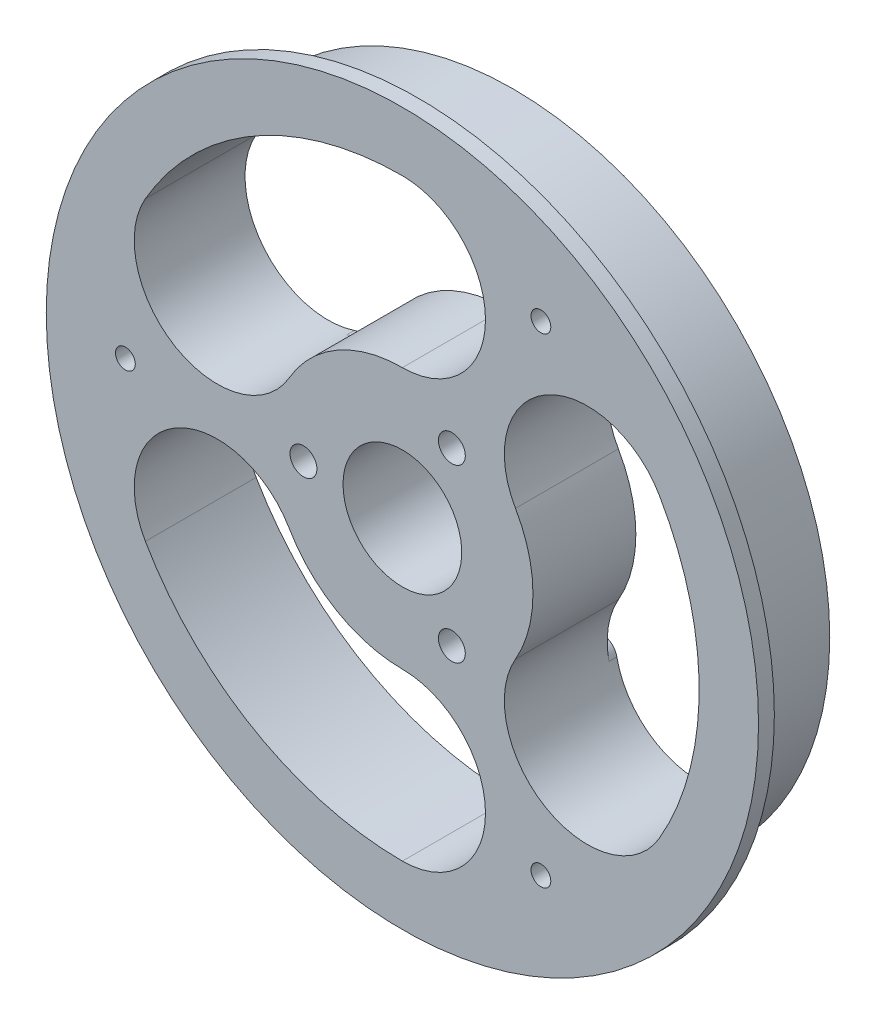
ISO-10303-21;
HEADER;
FILE_DESCRIPTION(('STEP AP214'),'2;1');
FILE_NAME('part.step','',(''),(''),'','','');
FILE_SCHEMA(('AUTOMOTIVE_DESIGN { 1 0 10303 214 1 1 1 1 }'));
ENDSEC;
DATA;
#1=APPLICATION_CONTEXT('core data for automotive mechanical design processes');
#2=APPLICATION_PROTOCOL_DEFINITION('international standard','automotive_design',2000,#1);
#3=PRODUCT_CONTEXT('',#1,'mechanical');
#4=PRODUCT('Part','Part','',(#3));
#5=PRODUCT_RELATED_PRODUCT_CATEGORY('part','',(#4));
#6=PRODUCT_DEFINITION_FORMATION('','',#4);
#7=PRODUCT_DEFINITION_CONTEXT('part definition',#1,'design');
#8=PRODUCT_DEFINITION('design','',#6,#7);
#9=PRODUCT_DEFINITION_SHAPE('','',#8);
#10=(LENGTH_UNIT() NAMED_UNIT(*) SI_UNIT(.MILLI.,.METRE.));
#11=(NAMED_UNIT(*) PLANE_ANGLE_UNIT() SI_UNIT($,.RADIAN.));
#12=(NAMED_UNIT(*) SI_UNIT($,.STERADIAN.) SOLID_ANGLE_UNIT());
#13=UNCERTAINTY_MEASURE_WITH_UNIT(LENGTH_MEASURE(1.E-05),#10,'distance_accuracy_value','');
#14=(GEOMETRIC_REPRESENTATION_CONTEXT(3) GLOBAL_UNCERTAINTY_ASSIGNED_CONTEXT((#13)) GLOBAL_UNIT_ASSIGNED_CONTEXT((#10,
#11,#12)) REPRESENTATION_CONTEXT('',''));
#15=CARTESIAN_POINT('',(0.,0.,0.));
#16=DIRECTION('',(0.,0.,1.));
#17=DIRECTION('',(1.,0.,0.));
#18=AXIS2_PLACEMENT_3D('',#15,#16,#17);
#19=CARTESIAN_POINT('',(0.,0.,0.));
#20=DIRECTION('',(0.,0.,1.));
#21=DIRECTION('',(1.,0.,0.));
#22=AXIS2_PLACEMENT_3D('',#19,#20,#21);
#23=CYLINDRICAL_SURFACE('',#22,7.5);
#24=CARTESIAN_POINT('',(0.,0.,14.));
#25=DIRECTION('',(0.,0.,-1.));
#26=DIRECTION('',(-1.,0.,0.));
#27=AXIS2_PLACEMENT_3D('',#24,#25,#26);
#28=CIRCLE('',#27,7.5);
#29=CARTESIAN_POINT('',(-7.5,0.,14.));
#30=VERTEX_POINT('',#29);
#31=EDGE_CURVE('E305',#30,#30,#28,.T.);
#32=ORIENTED_EDGE('',*,*,#31,.F.);
#33=EDGE_LOOP('',(#32));
#34=FACE_BOUND('',#33,.T.);
#35=CARTESIAN_POINT('',(0.,0.,1.));
#36=DIRECTION('',(0.,0.,-1.));
#37=DIRECTION('',(-1.,0.,0.));
#38=AXIS2_PLACEMENT_3D('',#35,#36,#37);
#39=CIRCLE('',#38,7.5);
#40=CARTESIAN_POINT('',(-7.5,0.,1.));
#41=VERTEX_POINT('',#40);
#42=EDGE_CURVE('E436',#41,#41,#39,.T.);
#43=ORIENTED_EDGE('',*,*,#42,.T.);
#44=EDGE_LOOP('',(#43));
#45=FACE_BOUND('',#44,.T.);
#46=ADVANCED_FACE('F37',(#34,#45),#23,.F.);
#47=CARTESIAN_POINT('',(6.25000000000005,-10.8253175473055,14.));
#48=DIRECTION('',(0.,0.,1.));
#49=DIRECTION('',(1.,0.,0.));
#50=AXIS2_PLACEMENT_3D('',#47,#48,#49);
#51=CYLINDRICAL_SURFACE('',#50,1.7);
#52=CARTESIAN_POINT('',(6.25000000000005,-10.8253175473055,14.));
#53=DIRECTION('',(0.,0.,1.));
#54=DIRECTION('',(1.,0.,0.));
#55=AXIS2_PLACEMENT_3D('',#52,#53,#54);
#56=CIRCLE('',#55,1.7);
#57=CARTESIAN_POINT('',(7.95000000000005,-10.8253175473055,14.));
#58=VERTEX_POINT('',#57);
#59=EDGE_CURVE('E302',#58,#58,#56,.T.);
#60=ORIENTED_EDGE('',*,*,#59,.T.);
#61=EDGE_LOOP('',(#60));
#62=FACE_BOUND('',#61,.T.);
#63=CARTESIAN_POINT('',(6.25000000000005,-10.8253175473055,0.999999999999999));
#64=DIRECTION('',(0.,0.,-1.));
#65=DIRECTION('',(-1.,0.,0.));
#66=AXIS2_PLACEMENT_3D('',#63,#64,#65);
#67=CIRCLE('',#66,1.7);
#68=CARTESIAN_POINT('',(4.55000000000006,-10.8253175473055,0.999999999999999));
#69=VERTEX_POINT('',#68);
#70=EDGE_CURVE('E433',#69,#69,#67,.F.);
#71=ORIENTED_EDGE('',*,*,#70,.F.);
#72=EDGE_LOOP('',(#71));
#73=FACE_BOUND('',#72,.T.);
#74=ADVANCED_FACE('F526',(#62,#73),#51,.F.);
#75=CARTESIAN_POINT('',(-12.5,0.,14.));
#76=DIRECTION('',(0.,0.,1.));
#77=DIRECTION('',(1.,0.,0.));
#78=AXIS2_PLACEMENT_3D('',#75,#76,#77);
#79=CYLINDRICAL_SURFACE('',#78,1.7);
#80=CARTESIAN_POINT('',(-12.5,0.,14.));
#81=DIRECTION('',(0.,0.,1.));
#82=DIRECTION('',(1.,0.,0.));
#83=AXIS2_PLACEMENT_3D('',#80,#81,#82);
#84=CIRCLE('',#83,1.7);
#85=CARTESIAN_POINT('',(-10.8,0.,14.));
#86=VERTEX_POINT('',#85);
#87=EDGE_CURVE('E299',#86,#86,#84,.T.);
#88=ORIENTED_EDGE('',*,*,#87,.T.);
#89=EDGE_LOOP('',(#88));
#90=FACE_BOUND('',#89,.T.);
#91=CARTESIAN_POINT('',(-12.5,0.,0.999999999999999));
#92=DIRECTION('',(0.,0.,-1.));
#93=DIRECTION('',(-1.,0.,0.));
#94=AXIS2_PLACEMENT_3D('',#91,#92,#93);
#95=CIRCLE('',#94,1.7);
#96=CARTESIAN_POINT('',(-14.2,0.,0.999999999999999));
#97=VERTEX_POINT('',#96);
#98=EDGE_CURVE('E430',#97,#97,#95,.F.);
#99=ORIENTED_EDGE('',*,*,#98,.F.);
#100=EDGE_LOOP('',(#99));
#101=FACE_BOUND('',#100,.T.);
#102=ADVANCED_FACE('F532',(#90,#101),#79,.F.);
#103=CARTESIAN_POINT('',(6.24999999999997,10.8253175473055,14.));
#104=DIRECTION('',(0.,0.,1.));
#105=DIRECTION('',(1.,0.,0.));
#106=AXIS2_PLACEMENT_3D('',#103,#104,#105);
#107=CYLINDRICAL_SURFACE('',#106,1.7);
#108=CARTESIAN_POINT('',(6.24999999999997,10.8253175473055,14.));
#109=DIRECTION('',(0.,0.,1.));
#110=DIRECTION('',(1.,0.,0.));
#111=AXIS2_PLACEMENT_3D('',#108,#109,#110);
#112=CIRCLE('',#111,1.7);
#113=CARTESIAN_POINT('',(7.94999999999997,10.8253175473055,14.));
#114=VERTEX_POINT('',#113);
#115=EDGE_CURVE('E289',#114,#114,#112,.T.);
#116=ORIENTED_EDGE('',*,*,#115,.T.);
#117=EDGE_LOOP('',(#116));
#118=FACE_BOUND('',#117,.T.);
#119=CARTESIAN_POINT('',(6.24999999999997,10.8253175473055,0.999999999999999));
#120=DIRECTION('',(0.,0.,-1.));
#121=DIRECTION('',(-1.,0.,0.));
#122=AXIS2_PLACEMENT_3D('',#119,#120,#121);
#123=CIRCLE('',#122,1.7);
#124=CARTESIAN_POINT('',(4.54999999999997,10.8253175473055,0.999999999999999));
#125=VERTEX_POINT('',#124);
#126=EDGE_CURVE('E427',#125,#125,#123,.F.);
#127=ORIENTED_EDGE('',*,*,#126,.F.);
#128=EDGE_LOOP('',(#127));
#129=FACE_BOUND('',#128,.T.);
#130=ADVANCED_FACE('F720',(#118,#129),#107,.F.);
#131=CARTESIAN_POINT('',(0.,0.,14.));
#132=DIRECTION('',(0.,0.,-1.));
#133=DIRECTION('',(-1.,0.,0.));
#134=AXIS2_PLACEMENT_3D('',#131,#132,#133);
#135=CYLINDRICAL_SURFACE('',#134,16.5);
#136=CARTESIAN_POINT('',(0.,0.,0.999999999999999));
#137=DIRECTION('',(0.,0.,-1.));
#138=DIRECTION('',(-1.,0.,0.));
#139=AXIS2_PLACEMENT_3D('',#136,#137,#138);
#140=CIRCLE('',#139,16.5);
#141=CARTESIAN_POINT('',(-14.2894191624433,8.24999999999997,0.999999999999999));
#142=VERTEX_POINT('',#141);
#143=CARTESIAN_POINT('',(0.,16.5,0.999999999999999));
#144=VERTEX_POINT('',#143);
#145=EDGE_CURVE('E424',#142,#144,#140,.T.);
#146=ORIENTED_EDGE('',*,*,#145,.F.);
#147=DIRECTION('',(0.,0.,-1.));
#148=VECTOR('',#147,1.);
#149=CARTESIAN_POINT('',(-14.2894191624433,8.24999999999997,14.));
#150=LINE('',#149,#148);
#151=CARTESIAN_POINT('',(-14.2894191624433,8.24999999999997,14.));
#152=VERTEX_POINT('',#151);
#153=EDGE_CURVE('E279',#152,#142,#150,.T.);
#154=ORIENTED_EDGE('',*,*,#153,.F.);
#155=CARTESIAN_POINT('',(0.,0.,14.));
#156=DIRECTION('',(0.,0.,1.));
#157=DIRECTION('',(-1.,0.,0.));
#158=AXIS2_PLACEMENT_3D('',#155,#156,#157);
#159=CIRCLE('',#158,16.5);
#160=CARTESIAN_POINT('',(0.,16.5,14.));
#161=VERTEX_POINT('',#160);
#162=EDGE_CURVE('E266',#161,#152,#159,.T.);
#163=ORIENTED_EDGE('',*,*,#162,.F.);
#164=DIRECTION('',(0.,0.,-1.));
#165=VECTOR('',#164,1.);
#166=CARTESIAN_POINT('',(0.,16.5,14.));
#167=LINE('',#166,#165);
#168=EDGE_CURVE('E286',#161,#144,#167,.T.);
#169=ORIENTED_EDGE('',*,*,#168,.T.);
#170=EDGE_LOOP('',(#146,#154,#163,#169));
#171=FACE_BOUND('',#170,.T.);
#172=ADVANCED_FACE('F711',(#171),#135,.T.);
#173=CARTESIAN_POINT('',(0.,0.,14.));
#174=DIRECTION('',(0.,0.,-1.));
#175=DIRECTION('',(-1.,0.,0.));
#176=AXIS2_PLACEMENT_3D('',#173,#174,#175);
#177=CYLINDRICAL_SURFACE('',#176,16.5);
#178=CARTESIAN_POINT('',(0.,0.,0.999999999999999));
#179=DIRECTION('',(0.,0.,-1.));
#180=DIRECTION('',(-1.,0.,0.));
#181=AXIS2_PLACEMENT_3D('',#178,#179,#180);
#182=CIRCLE('',#181,16.5);
#183=CARTESIAN_POINT('',(0.,-16.5,0.999999999999999));
#184=VERTEX_POINT('',#183);
#185=CARTESIAN_POINT('',(-14.2894191624432,-8.25,0.999999999999999));
#186=VERTEX_POINT('',#185);
#187=EDGE_CURVE('E419',#184,#186,#182,.T.);
#188=ORIENTED_EDGE('',*,*,#187,.F.);
#189=DIRECTION('',(0.,0.,-1.));
#190=VECTOR('',#189,1.);
#191=CARTESIAN_POINT('',(0.,-16.5,14.));
#192=LINE('',#191,#190);
#193=CARTESIAN_POINT('',(0.,-16.5,14.));
#194=VERTEX_POINT('',#193);
#195=EDGE_CURVE('E247',#194,#184,#192,.T.);
#196=ORIENTED_EDGE('',*,*,#195,.F.);
#197=CARTESIAN_POINT('',(0.,0.,14.));
#198=DIRECTION('',(0.,0.,1.));
#199=DIRECTION('',(-1.,0.,0.));
#200=AXIS2_PLACEMENT_3D('',#197,#198,#199);
#201=CIRCLE('',#200,16.5);
#202=CARTESIAN_POINT('',(-14.2894191624432,-8.25,14.));
#203=VERTEX_POINT('',#202);
#204=EDGE_CURVE('E234',#203,#194,#201,.T.);
#205=ORIENTED_EDGE('',*,*,#204,.F.);
#206=DIRECTION('',(0.,0.,-1.));
#207=VECTOR('',#206,1.);
#208=CARTESIAN_POINT('',(-14.2894191624432,-8.25,14.));
#209=LINE('',#208,#207);
#210=EDGE_CURVE('E255',#203,#186,#209,.T.);
#211=ORIENTED_EDGE('',*,*,#210,.T.);
#212=EDGE_LOOP('',(#188,#196,#205,#211));
#213=FACE_BOUND('',#212,.T.);
#214=ADVANCED_FACE('F497',(#213),#177,.T.);
#215=CARTESIAN_POINT('',(0.,0.,14.));
#216=DIRECTION('',(0.,0.,-1.));
#217=DIRECTION('',(-1.,0.,0.));
#218=AXIS2_PLACEMENT_3D('',#215,#216,#217);
#219=CYLINDRICAL_SURFACE('',#218,16.5);
#220=CARTESIAN_POINT('',(0.,0.,0.999999999999999));
#221=DIRECTION('',(0.,0.,-1.));
#222=DIRECTION('',(-1.,0.,0.));
#223=AXIS2_PLACEMENT_3D('',#220,#221,#222);
#224=CIRCLE('',#223,16.5);
#225=CARTESIAN_POINT('',(14.2894191624432,8.25000000000002,0.999999999999999));
#226=VERTEX_POINT('',#225);
#227=CARTESIAN_POINT('',(14.2894191624432,-8.25000000000001,0.999999999999999));
#228=VERTEX_POINT('',#227);
#229=EDGE_CURVE('E201',#226,#228,#224,.T.);
#230=ORIENTED_EDGE('',*,*,#229,.F.);
#231=DIRECTION('',(0.,0.,-1.));
#232=VECTOR('',#231,1.);
#233=CARTESIAN_POINT('',(14.2894191624432,8.25000000000002,14.));
#234=LINE('',#233,#232);
#235=CARTESIAN_POINT('',(14.2894191624432,8.25000000000002,14.));
#236=VERTEX_POINT('',#235);
#237=EDGE_CURVE('E212',#236,#226,#234,.T.);
#238=ORIENTED_EDGE('',*,*,#237,.F.);
#239=CARTESIAN_POINT('',(0.,0.,14.));
#240=DIRECTION('',(0.,0.,1.));
#241=DIRECTION('',(-1.,0.,0.));
#242=AXIS2_PLACEMENT_3D('',#239,#240,#241);
#243=CIRCLE('',#242,16.5);
#244=CARTESIAN_POINT('',(14.2894191624432,-8.25000000000001,14.));
#245=VERTEX_POINT('',#244);
#246=EDGE_CURVE('E458',#245,#236,#243,.T.);
#247=ORIENTED_EDGE('',*,*,#246,.F.);
#248=DIRECTION('',(0.,0.,-1.));
#249=VECTOR('',#248,1.);
#250=CARTESIAN_POINT('',(14.2894191624432,-8.25000000000001,14.));
#251=LINE('',#250,#249);
#252=EDGE_CURVE('E214',#245,#228,#251,.T.);
#253=ORIENTED_EDGE('',*,*,#252,.T.);
#254=EDGE_LOOP('',(#230,#238,#247,#253));
#255=FACE_BOUND('',#254,.T.);
#256=ADVANCED_FACE('F210',(#255),#219,.T.);
#257=CARTESIAN_POINT('',(0.,0.,0.));
#258=DIRECTION('',(0.,0.,1.));
#259=DIRECTION('',(1.,0.,0.));
#260=AXIS2_PLACEMENT_3D('',#257,#258,#259);
#261=PLANE('',#260);
#262=CARTESIAN_POINT('',(17.4999999999999,30.3108891324554,0.));
#263=DIRECTION('',(0.,0.,-1.));
#264=DIRECTION('',(-1.,0.,0.));
#265=AXIS2_PLACEMENT_3D('',#262,#263,#264);
#266=CIRCLE('',#265,1.25);
#267=CARTESIAN_POINT('',(16.2499999999999,30.3108891324554,0.));
#268=VERTEX_POINT('',#267);
#269=EDGE_CURVE('E439',#268,#268,#266,.T.);
#270=ORIENTED_EDGE('',*,*,#269,.F.);
#271=EDGE_LOOP('',(#270));
#272=FACE_BOUND('',#271,.T.);
#273=CARTESIAN_POINT('',(-35.,0.,0.));
#274=DIRECTION('',(0.,0.,-1.));
#275=DIRECTION('',(-1.,0.,0.));
#276=AXIS2_PLACEMENT_3D('',#273,#274,#275);
#277=CIRCLE('',#276,1.25);
#278=CARTESIAN_POINT('',(-36.25,0.,0.));
#279=VERTEX_POINT('',#278);
#280=EDGE_CURVE('E445',#279,#279,#277,.T.);
#281=ORIENTED_EDGE('',*,*,#280,.F.);
#282=EDGE_LOOP('',(#281));
#283=FACE_BOUND('',#282,.T.);
#284=CARTESIAN_POINT('',(17.4999999999998,-30.3108891324555,0.));
#285=DIRECTION('',(0.,0.,-1.));
#286=DIRECTION('',(-1.,0.,0.));
#287=AXIS2_PLACEMENT_3D('',#284,#285,#286);
#288=CIRCLE('',#287,1.25);
#289=CARTESIAN_POINT('',(16.2499999999998,-30.3108891324555,0.));
#290=VERTEX_POINT('',#289);
#291=EDGE_CURVE('E451',#290,#290,#288,.T.);
#292=ORIENTED_EDGE('',*,*,#291,.F.);
#293=EDGE_LOOP('',(#292));
#294=FACE_BOUND('',#293,.T.);
#295=CARTESIAN_POINT('',(-23.3826859021799,13.4999999999999,0.));
#296=DIRECTION('',(0.,0.,-1.));
#297=DIRECTION('',(-1.,0.,0.));
#298=AXIS2_PLACEMENT_3D('',#295,#296,#297);
#299=CIRCLE('',#298,10.5);
#300=CARTESIAN_POINT('',(-20.0631167799157,3.53855126788723,0.));
#301=VERTEX_POINT('',#300);
#302=CARTESIAN_POINT('',(-32.4759526419165,18.7499999999999,0.));
#303=VERTEX_POINT('',#302);
#304=EDGE_CURVE('E258',#301,#303,#299,.T.);
#305=ORIENTED_EDGE('',*,*,#304,.F.);
#306=CARTESIAN_POINT('',(-19.4308178994844,1.64113246177052,0.));
#307=DIRECTION('',(0.,0.,1.));
#308=DIRECTION('',(1.,0.,0.));
#309=AXIS2_PLACEMENT_3D('',#306,#307,#308);
#310=CIRCLE('',#309,2.);
#311=CARTESIAN_POINT('',(-17.4379134995373,1.47281118364021,0.));
#312=VERTEX_POINT('',#311);
#313=EDGE_CURVE('E331',#301,#312,#310,.F.);
#314=ORIENTED_EDGE('',*,*,#313,.T.);
#315=CARTESIAN_POINT('',(0.,0.,0.));
#316=DIRECTION('',(0.,0.,-1.));
#317=DIRECTION('',(-1.,0.,0.));
#318=AXIS2_PLACEMENT_3D('',#315,#316,#317);
#319=CIRCLE('',#318,17.5);
#320=CARTESIAN_POINT('',(-17.4379134995373,-1.47281118364024,0.));
#321=VERTEX_POINT('',#320);
#322=EDGE_CURVE('E409',#321,#312,#319,.T.);
#323=ORIENTED_EDGE('',*,*,#322,.F.);
#324=CARTESIAN_POINT('',(-19.4308178994844,-1.64113246177056,0.));
#325=DIRECTION('',(0.,0.,1.));
#326=DIRECTION('',(1.,0.,0.));
#327=AXIS2_PLACEMENT_3D('',#324,#325,#326);
#328=CIRCLE('',#327,2.);
#329=CARTESIAN_POINT('',(-20.0631167799157,-3.53855126788727,0.));
#330=VERTEX_POINT('',#329);
#331=EDGE_CURVE('E329',#321,#330,#328,.F.);
#332=ORIENTED_EDGE('',*,*,#331,.T.);
#333=CARTESIAN_POINT('',(-23.3826859021798,-13.5,0.));
#334=DIRECTION('',(0.,0.,-1.));
#335=DIRECTION('',(-1.,0.,0.));
#336=AXIS2_PLACEMENT_3D('',#333,#334,#335);
#337=CIRCLE('',#336,10.5);
#338=CARTESIAN_POINT('',(-32.4759526419165,-18.75,0.));
#339=VERTEX_POINT('',#338);
#340=EDGE_CURVE('E238',#339,#330,#337,.T.);
#341=ORIENTED_EDGE('',*,*,#340,.F.);
#342=CARTESIAN_POINT('',(0.,0.,0.));
#343=DIRECTION('',(0.,0.,-1.));
#344=DIRECTION('',(-1.,0.,0.));
#345=AXIS2_PLACEMENT_3D('',#342,#343,#344);
#346=CIRCLE('',#345,37.5);
#347=CARTESIAN_POINT('',(0.,-37.5,0.));
#348=VERTEX_POINT('',#347);
#349=EDGE_CURVE('E250',#348,#339,#346,.T.);
#350=ORIENTED_EDGE('',*,*,#349,.F.);
#351=CARTESIAN_POINT('',(0.,-27.,0.));
#352=DIRECTION('',(0.,0.,-1.));
#353=DIRECTION('',(-1.,0.,0.));
#354=AXIS2_PLACEMENT_3D('',#351,#352,#353);
#355=CIRCLE('',#354,10.5);
#356=CARTESIAN_POINT('',(6.96708309937386,-19.1444444444444,0.));
#357=VERTEX_POINT('',#356);
#358=EDGE_CURVE('E248',#357,#348,#355,.T.);
#359=ORIENTED_EDGE('',*,*,#358,.F.);
#360=CARTESIAN_POINT('',(8.29414654687363,-17.6481481481481,0.));
#361=DIRECTION('',(0.,0.,1.));
#362=DIRECTION('',(1.,0.,0.));
#363=AXIS2_PLACEMENT_3D('',#360,#361,#362);
#364=CIRCLE('',#363,2.);
#365=CARTESIAN_POINT('',(7.44346484975839,-15.838081671415,0.));
#366=VERTEX_POINT('',#365);
#367=EDGE_CURVE('E327',#357,#366,#364,.F.);
#368=ORIENTED_EDGE('',*,*,#367,.T.);
#369=CARTESIAN_POINT('',(9.99444864977892,-14.3652704877748,0.));
#370=VERTEX_POINT('',#369);
#371=EDGE_CURVE('E412',#370,#366,#319,.T.);
#372=ORIENTED_EDGE('',*,*,#371,.F.);
#373=CARTESIAN_POINT('',(11.1366713526108,-16.0070156863776,0.));
#374=DIRECTION('',(0.,0.,1.));
#375=DIRECTION('',(1.,0.,0.));
#376=AXIS2_PLACEMENT_3D('',#373,#374,#375);
#377=CIRCLE('',#376,2.);
#378=CARTESIAN_POINT('',(13.0960336805418,-15.6058931765572,0.));
#379=VERTEX_POINT('',#378);
#380=EDGE_CURVE('E325',#370,#379,#377,.F.);
#381=ORIENTED_EDGE('',*,*,#380,.T.);
#382=CARTESIAN_POINT('',(23.3826859021798,-13.5,0.));
#383=DIRECTION('',(0.,0.,-1.));
#384=DIRECTION('',(-1.,0.,0.));
#385=AXIS2_PLACEMENT_3D('',#382,#383,#384);
#386=CIRCLE('',#385,10.5);
#387=CARTESIAN_POINT('',(32.4759526419165,-18.75,0.));
#388=VERTEX_POINT('',#387);
#389=EDGE_CURVE('E460',#388,#379,#386,.T.);
#390=ORIENTED_EDGE('',*,*,#389,.F.);
#391=CARTESIAN_POINT('',(0.,0.,0.));
#392=DIRECTION('',(0.,0.,-1.));
#393=DIRECTION('',(-1.,0.,0.));
#394=AXIS2_PLACEMENT_3D('',#391,#392,#393);
#395=CIRCLE('',#394,37.5);
#396=CARTESIAN_POINT('',(32.4759526419164,18.7500000000001,0.));
#397=VERTEX_POINT('',#396);
#398=EDGE_CURVE('E465',#397,#388,#395,.T.);
#399=ORIENTED_EDGE('',*,*,#398,.F.);
#400=CARTESIAN_POINT('',(23.3826859021798,13.5,0.));
#401=DIRECTION('',(0.,0.,-1.));
#402=DIRECTION('',(-1.,0.,0.));
#403=AXIS2_PLACEMENT_3D('',#400,#401,#402);
#404=CIRCLE('',#403,10.5);
#405=CARTESIAN_POINT('',(13.0960336805418,15.6058931765572,0.));
#406=VERTEX_POINT('',#405);
#407=EDGE_CURVE('E457',#406,#397,#404,.T.);
#408=ORIENTED_EDGE('',*,*,#407,.F.);
#409=CARTESIAN_POINT('',(11.1366713526108,16.0070156863776,0.));
#410=DIRECTION('',(0.,0.,1.));
#411=DIRECTION('',(1.,0.,0.));
#412=AXIS2_PLACEMENT_3D('',#409,#410,#411);
#413=CIRCLE('',#412,2.);
#414=CARTESIAN_POINT('',(9.9944486497789,14.3652704877748,0.));
#415=VERTEX_POINT('',#414);
#416=EDGE_CURVE('E321',#406,#415,#413,.F.);
#417=ORIENTED_EDGE('',*,*,#416,.T.);
#418=CARTESIAN_POINT('',(7.44346484975835,15.838081671415,0.));
#419=VERTEX_POINT('',#418);
#420=EDGE_CURVE('E386',#419,#415,#319,.T.);
#421=ORIENTED_EDGE('',*,*,#420,.F.);
#422=CARTESIAN_POINT('',(8.29414654687359,17.6481481481481,0.));
#423=DIRECTION('',(0.,0.,1.));
#424=DIRECTION('',(1.,0.,0.));
#425=AXIS2_PLACEMENT_3D('',#422,#423,#424);
#426=CIRCLE('',#425,2.);
#427=CARTESIAN_POINT('',(6.96708309937381,19.1444444444444,0.));
#428=VERTEX_POINT('',#427);
#429=EDGE_CURVE('E323',#419,#428,#426,.F.);
#430=ORIENTED_EDGE('',*,*,#429,.T.);
#431=CARTESIAN_POINT('',(0.,27.,0.));
#432=DIRECTION('',(0.,0.,-1.));
#433=DIRECTION('',(-1.,0.,0.));
#434=AXIS2_PLACEMENT_3D('',#431,#432,#433);
#435=CIRCLE('',#434,10.5);
#436=CARTESIAN_POINT('',(0.,37.5,0.));
#437=VERTEX_POINT('',#436);
#438=EDGE_CURVE('E270',#437,#428,#435,.T.);
#439=ORIENTED_EDGE('',*,*,#438,.F.);
#440=CARTESIAN_POINT('',(0.,0.,0.));
#441=DIRECTION('',(0.,0.,-1.));
#442=DIRECTION('',(-1.,0.,0.));
#443=AXIS2_PLACEMENT_3D('',#440,#441,#442);
#444=CIRCLE('',#443,37.5);
#445=EDGE_CURVE('E281',#303,#437,#444,.T.);
#446=ORIENTED_EDGE('',*,*,#445,.F.);
#447=EDGE_LOOP('',(#305,#314,#323,#332,#341,#350,#359,#368,#372,#381,#390,#399,#408,#417,#421,
#430,#439,#446));
#448=FACE_BOUND('',#447,.T.);
#449=CARTESIAN_POINT('',(0.,0.,0.));
#450=DIRECTION('',(0.,0.,1.));
#451=DIRECTION('',(1.,0.,0.));
#452=AXIS2_PLACEMENT_3D('',#449,#450,#451);
#453=CIRCLE('',#452,40.);
#454=CARTESIAN_POINT('',(40.,0.,0.));
#455=VERTEX_POINT('',#454);
#456=EDGE_CURVE('E312',#455,#455,#453,.T.);
#457=ORIENTED_EDGE('',*,*,#456,.F.);
#458=EDGE_LOOP('',(#457));
#459=FACE_BOUND('',#458,.T.);
#460=ADVANCED_FACE('F383',(#272,#283,#294,#448,#459),#261,.F.);
#461=CARTESIAN_POINT('',(0.,0.,14.));
#462=DIRECTION('',(0.,0.,1.));
#463=DIRECTION('',(1.,0.,0.));
#464=AXIS2_PLACEMENT_3D('',#461,#462,#463);
#465=PLANE('',#464);
#466=CARTESIAN_POINT('',(17.4999999999999,30.3108891324554,14.));
#467=DIRECTION('',(0.,0.,-1.));
#468=DIRECTION('',(-1.,0.,0.));
#469=AXIS2_PLACEMENT_3D('',#466,#467,#468);
#470=CIRCLE('',#469,1.25);
#471=CARTESIAN_POINT('',(16.2499999999999,30.3108891324554,14.));
#472=VERTEX_POINT('',#471);
#473=EDGE_CURVE('E442',#472,#472,#470,.T.);
#474=ORIENTED_EDGE('',*,*,#473,.T.);
#475=EDGE_LOOP('',(#474));
#476=FACE_BOUND('',#475,.T.);
#477=CARTESIAN_POINT('',(-35.,0.,14.));
#478=DIRECTION('',(0.,0.,-1.));
#479=DIRECTION('',(-1.,0.,0.));
#480=AXIS2_PLACEMENT_3D('',#477,#478,#479);
#481=CIRCLE('',#480,1.24999999999999);
#482=CARTESIAN_POINT('',(-36.25,0.,14.));
#483=VERTEX_POINT('',#482);
#484=EDGE_CURVE('E448',#483,#483,#481,.T.);
#485=ORIENTED_EDGE('',*,*,#484,.T.);
#486=EDGE_LOOP('',(#485));
#487=FACE_BOUND('',#486,.T.);
#488=CARTESIAN_POINT('',(17.4999999999998,-30.3108891324555,14.));
#489=DIRECTION('',(0.,0.,-1.));
#490=DIRECTION('',(-1.,0.,0.));
#491=AXIS2_PLACEMENT_3D('',#488,#489,#490);
#492=CIRCLE('',#491,1.25);
#493=CARTESIAN_POINT('',(16.2499999999998,-30.3108891324555,14.));
#494=VERTEX_POINT('',#493);
#495=EDGE_CURVE('E454',#494,#494,#492,.T.);
#496=ORIENTED_EDGE('',*,*,#495,.T.);
#497=EDGE_LOOP('',(#496));
#498=FACE_BOUND('',#497,.T.);
#499=ORIENTED_EDGE('',*,*,#246,.T.);
#500=CARTESIAN_POINT('',(23.3826859021798,13.5,14.));
#501=DIRECTION('',(0.,0.,-1.));
#502=DIRECTION('',(-1.,0.,0.));
#503=AXIS2_PLACEMENT_3D('',#500,#501,#502);
#504=CIRCLE('',#503,10.5);
#505=CARTESIAN_POINT('',(32.4759526419164,18.7500000000001,14.));
#506=VERTEX_POINT('',#505);
#507=EDGE_CURVE('E221',#236,#506,#504,.T.);
#508=ORIENTED_EDGE('',*,*,#507,.T.);
#509=CARTESIAN_POINT('',(0.,0.,14.));
#510=DIRECTION('',(0.,0.,-1.));
#511=DIRECTION('',(-1.,0.,0.));
#512=AXIS2_PLACEMENT_3D('',#509,#510,#511);
#513=CIRCLE('',#512,37.5);
#514=CARTESIAN_POINT('',(32.4759526419165,-18.75,14.));
#515=VERTEX_POINT('',#514);
#516=EDGE_CURVE('E230',#506,#515,#513,.T.);
#517=ORIENTED_EDGE('',*,*,#516,.T.);
#518=CARTESIAN_POINT('',(23.3826859021798,-13.5,14.));
#519=DIRECTION('',(0.,0.,-1.));
#520=DIRECTION('',(-1.,0.,0.));
#521=AXIS2_PLACEMENT_3D('',#518,#519,#520);
#522=CIRCLE('',#521,10.5);
#523=EDGE_CURVE('E224',#515,#245,#522,.T.);
#524=ORIENTED_EDGE('',*,*,#523,.T.);
#525=EDGE_LOOP('',(#499,#508,#517,#524));
#526=FACE_BOUND('',#525,.T.);
#527=ORIENTED_EDGE('',*,*,#204,.T.);
#528=CARTESIAN_POINT('',(0.,-27.,14.));
#529=DIRECTION('',(0.,0.,-1.));
#530=DIRECTION('',(-1.,0.,0.));
#531=AXIS2_PLACEMENT_3D('',#528,#529,#530);
#532=CIRCLE('',#531,10.5);
#533=CARTESIAN_POINT('',(0.,-37.5,14.));
#534=VERTEX_POINT('',#533);
#535=EDGE_CURVE('E237',#194,#534,#532,.T.);
#536=ORIENTED_EDGE('',*,*,#535,.T.);
#537=CARTESIAN_POINT('',(0.,0.,14.));
#538=DIRECTION('',(0.,0.,-1.));
#539=DIRECTION('',(-1.,0.,0.));
#540=AXIS2_PLACEMENT_3D('',#537,#538,#539);
#541=CIRCLE('',#540,37.5);
#542=CARTESIAN_POINT('',(-32.4759526419165,-18.75,14.));
#543=VERTEX_POINT('',#542);
#544=EDGE_CURVE('E241',#534,#543,#541,.T.);
#545=ORIENTED_EDGE('',*,*,#544,.T.);
#546=CARTESIAN_POINT('',(-23.3826859021798,-13.5,14.));
#547=DIRECTION('',(0.,0.,-1.));
#548=DIRECTION('',(-1.,0.,0.));
#549=AXIS2_PLACEMENT_3D('',#546,#547,#548);
#550=CIRCLE('',#549,10.5);
#551=EDGE_CURVE('E244',#543,#203,#550,.T.);
#552=ORIENTED_EDGE('',*,*,#551,.T.);
#553=EDGE_LOOP('',(#527,#536,#545,#552));
#554=FACE_BOUND('',#553,.T.);
#555=ORIENTED_EDGE('',*,*,#162,.T.);
#556=CARTESIAN_POINT('',(-23.3826859021799,13.4999999999999,14.));
#557=DIRECTION('',(0.,0.,-1.));
#558=DIRECTION('',(-1.,0.,0.));
#559=AXIS2_PLACEMENT_3D('',#556,#557,#558);
#560=CIRCLE('',#559,10.5);
#561=CARTESIAN_POINT('',(-32.4759526419165,18.7499999999999,14.));
#562=VERTEX_POINT('',#561);
#563=EDGE_CURVE('E269',#152,#562,#560,.T.);
#564=ORIENTED_EDGE('',*,*,#563,.T.);
#565=CARTESIAN_POINT('',(0.,0.,14.));
#566=DIRECTION('',(0.,0.,-1.));
#567=DIRECTION('',(-1.,0.,0.));
#568=AXIS2_PLACEMENT_3D('',#565,#566,#567);
#569=CIRCLE('',#568,37.5);
#570=CARTESIAN_POINT('',(0.,37.5,14.));
#571=VERTEX_POINT('',#570);
#572=EDGE_CURVE('E273',#562,#571,#569,.T.);
#573=ORIENTED_EDGE('',*,*,#572,.T.);
#574=CARTESIAN_POINT('',(0.,27.,14.));
#575=DIRECTION('',(0.,0.,-1.));
#576=DIRECTION('',(-1.,0.,0.));
#577=AXIS2_PLACEMENT_3D('',#574,#575,#576);
#578=CIRCLE('',#577,10.5);
#579=EDGE_CURVE('E276',#571,#161,#578,.T.);
#580=ORIENTED_EDGE('',*,*,#579,.T.);
#581=EDGE_LOOP('',(#555,#564,#573,#580));
#582=FACE_BOUND('',#581,.T.);
#583=ORIENTED_EDGE('',*,*,#115,.F.);
#584=EDGE_LOOP('',(#583));
#585=FACE_BOUND('',#584,.T.);
#586=ORIENTED_EDGE('',*,*,#87,.F.);
#587=EDGE_LOOP('',(#586));
#588=FACE_BOUND('',#587,.T.);
#589=ORIENTED_EDGE('',*,*,#59,.F.);
#590=EDGE_LOOP('',(#589));
#591=FACE_BOUND('',#590,.T.);
#592=CARTESIAN_POINT('',(0.,0.,14.));
#593=DIRECTION('',(0.,0.,1.));
#594=DIRECTION('',(1.,0.,0.));
#595=AXIS2_PLACEMENT_3D('',#592,#593,#594);
#596=CIRCLE('',#595,45.);
#597=CARTESIAN_POINT('',(45.,0.,14.));
#598=VERTEX_POINT('',#597);
#599=EDGE_CURVE('E309',#598,#598,#596,.T.);
#600=ORIENTED_EDGE('',*,*,#599,.T.);
#601=EDGE_LOOP('',(#600));
#602=FACE_BOUND('',#601,.T.);
#603=ORIENTED_EDGE('',*,*,#31,.T.);
#604=EDGE_LOOP('',(#603));
#605=FACE_BOUND('',#604,.T.);
#606=ADVANCED_FACE('F503',(#476,#487,#498,#526,#554,#582,#585,#588,#591,#602,#605),#465,.T.);
#607=CARTESIAN_POINT('',(0.,0.,12.));
#608=DIRECTION('',(0.,0.,-1.));
#609=DIRECTION('',(-1.,0.,0.));
#610=AXIS2_PLACEMENT_3D('',#607,#608,#609);
#611=CYLINDRICAL_SURFACE('',#610,40.);
#612=CARTESIAN_POINT('',(0.,0.,12.));
#613=DIRECTION('',(0.,0.,1.));
#614=DIRECTION('',(1.,0.,0.));
#615=AXIS2_PLACEMENT_3D('',#612,#613,#614);
#616=CIRCLE('',#615,40.);
#617=CARTESIAN_POINT('',(40.,0.,12.));
#618=VERTEX_POINT('',#617);
#619=EDGE_CURVE('E206',#618,#618,#616,.T.);
#620=ORIENTED_EDGE('',*,*,#619,.F.);
#621=EDGE_LOOP('',(#620));
#622=FACE_BOUND('',#621,.T.);
#623=ORIENTED_EDGE('',*,*,#456,.T.);
#624=EDGE_LOOP('',(#623));
#625=FACE_BOUND('',#624,.T.);
#626=ADVANCED_FACE('F541',(#622,#625),#611,.T.);
#627=CARTESIAN_POINT('',(0.,0.,12.));
#628=DIRECTION('',(0.,0.,1.));
#629=DIRECTION('',(1.,0.,0.));
#630=AXIS2_PLACEMENT_3D('',#627,#628,#629);
#631=PLANE('',#630);
#632=CARTESIAN_POINT('',(0.,0.,12.));
#633=DIRECTION('',(0.,0.,1.));
#634=DIRECTION('',(1.,0.,0.));
#635=AXIS2_PLACEMENT_3D('',#632,#633,#634);
#636=CIRCLE('',#635,45.);
#637=CARTESIAN_POINT('',(45.,0.,12.));
#638=VERTEX_POINT('',#637);
#639=EDGE_CURVE('E308',#638,#638,#636,.T.);
#640=ORIENTED_EDGE('',*,*,#639,.F.);
#641=EDGE_LOOP('',(#640));
#642=FACE_BOUND('',#641,.T.);
#643=ORIENTED_EDGE('',*,*,#619,.T.);
#644=EDGE_LOOP('',(#643));
#645=FACE_BOUND('',#644,.T.);
#646=ADVANCED_FACE('F543',(#642,#645),#631,.F.);
#647=CARTESIAN_POINT('',(0.,0.,14.));
#648=DIRECTION('',(0.,0.,-1.));
#649=DIRECTION('',(-1.,0.,0.));
#650=AXIS2_PLACEMENT_3D('',#647,#648,#649);
#651=CYLINDRICAL_SURFACE('',#650,45.);
#652=ORIENTED_EDGE('',*,*,#599,.F.);
#653=EDGE_LOOP('',(#652));
#654=FACE_BOUND('',#653,.T.);
#655=ORIENTED_EDGE('',*,*,#639,.T.);
#656=EDGE_LOOP('',(#655));
#657=FACE_BOUND('',#656,.T.);
#658=ADVANCED_FACE('F546',(#654,#657),#651,.T.);
#659=CARTESIAN_POINT('',(0.,27.,14.));
#660=DIRECTION('',(0.,0.,-1.));
#661=DIRECTION('',(-1.,0.,0.));
#662=AXIS2_PLACEMENT_3D('',#659,#660,#661);
#663=CYLINDRICAL_SURFACE('',#662,10.5);
#664=ORIENTED_EDGE('',*,*,#438,.T.);
#665=DIRECTION('',(0.,0.,-1.));
#666=VECTOR('',#665,1.);
#667=CARTESIAN_POINT('',(6.96708309937381,19.1444444444444,14.));
#668=LINE('',#667,#666);
#669=CARTESIAN_POINT('',(6.96708309937381,19.1444444444444,0.999999999999999));
#670=VERTEX_POINT('',#669);
#671=EDGE_CURVE('E350',#428,#670,#668,.F.);
#672=ORIENTED_EDGE('',*,*,#671,.T.);
#673=CARTESIAN_POINT('',(0.,27.,0.999999999999999));
#674=DIRECTION('',(0.,0.,-1.));
#675=DIRECTION('',(-1.,0.,0.));
#676=AXIS2_PLACEMENT_3D('',#673,#674,#675);
#677=CIRCLE('',#676,10.5);
#678=EDGE_CURVE('E369',#144,#670,#677,.F.);
#679=ORIENTED_EDGE('',*,*,#678,.F.);
#680=ORIENTED_EDGE('',*,*,#168,.F.);
#681=ORIENTED_EDGE('',*,*,#579,.F.);
#682=DIRECTION('',(0.,0.,-1.));
#683=VECTOR('',#682,1.);
#684=CARTESIAN_POINT('',(0.,37.5,14.));
#685=LINE('',#684,#683);
#686=EDGE_CURVE('E290',#571,#437,#685,.T.);
#687=ORIENTED_EDGE('',*,*,#686,.T.);
#688=EDGE_LOOP('',(#664,#672,#679,#680,#681,#687));
#689=FACE_BOUND('',#688,.T.);
#690=ADVANCED_FACE('F388',(#689),#663,.F.);
#691=CARTESIAN_POINT('',(0.,0.,14.));
#692=DIRECTION('',(0.,0.,-1.));
#693=DIRECTION('',(-1.,0.,0.));
#694=AXIS2_PLACEMENT_3D('',#691,#692,#693);
#695=CYLINDRICAL_SURFACE('',#694,37.5);
#696=ORIENTED_EDGE('',*,*,#445,.T.);
#697=ORIENTED_EDGE('',*,*,#686,.F.);
#698=ORIENTED_EDGE('',*,*,#572,.F.);
#699=DIRECTION('',(0.,0.,-1.));
#700=VECTOR('',#699,1.);
#701=CARTESIAN_POINT('',(-32.4759526419165,18.7499999999999,14.));
#702=LINE('',#701,#700);
#703=EDGE_CURVE('E292',#562,#303,#702,.T.);
#704=ORIENTED_EDGE('',*,*,#703,.T.);
#705=EDGE_LOOP('',(#696,#697,#698,#704));
#706=FACE_BOUND('',#705,.T.);
#707=ADVANCED_FACE('F391',(#706),#695,.F.);
#708=CARTESIAN_POINT('',(-23.3826859021799,13.4999999999999,14.));
#709=DIRECTION('',(0.,0.,-1.));
#710=DIRECTION('',(-1.,0.,0.));
#711=AXIS2_PLACEMENT_3D('',#708,#709,#710);
#712=CYLINDRICAL_SURFACE('',#711,10.5);
#713=CARTESIAN_POINT('',(-23.3826859021799,13.4999999999999,0.999999999999999));
#714=DIRECTION('',(0.,0.,-1.));
#715=DIRECTION('',(-1.,0.,0.));
#716=AXIS2_PLACEMENT_3D('',#713,#714,#715);
#717=CIRCLE('',#716,10.5);
#718=CARTESIAN_POINT('',(-20.0631167799157,3.53855126788723,0.999999999999999));
#719=VERTEX_POINT('',#718);
#720=EDGE_CURVE('E399',#719,#142,#717,.F.);
#721=ORIENTED_EDGE('',*,*,#720,.F.);
#722=DIRECTION('',(0.,0.,-1.));
#723=VECTOR('',#722,1.);
#724=CARTESIAN_POINT('',(-20.0631167799157,3.53855126788723,14.));
#725=LINE('',#724,#723);
#726=EDGE_CURVE('E205',#719,#301,#725,.T.);
#727=ORIENTED_EDGE('',*,*,#726,.T.);
#728=ORIENTED_EDGE('',*,*,#304,.T.);
#729=ORIENTED_EDGE('',*,*,#703,.F.);
#730=ORIENTED_EDGE('',*,*,#563,.F.);
#731=ORIENTED_EDGE('',*,*,#153,.T.);
#732=EDGE_LOOP('',(#721,#727,#728,#729,#730,#731));
#733=FACE_BOUND('',#732,.T.);
#734=ADVANCED_FACE('F396',(#733),#712,.F.);
#735=CARTESIAN_POINT('',(-23.3826859021798,-13.5,14.));
#736=DIRECTION('',(0.,0.,-1.));
#737=DIRECTION('',(-1.,0.,0.));
#738=AXIS2_PLACEMENT_3D('',#735,#736,#737);
#739=CYLINDRICAL_SURFACE('',#738,10.5);
#740=ORIENTED_EDGE('',*,*,#340,.T.);
#741=DIRECTION('',(0.,0.,-1.));
#742=VECTOR('',#741,1.);
#743=CARTESIAN_POINT('',(-20.0631167799157,-3.53855126788727,14.));
#744=LINE('',#743,#742);
#745=CARTESIAN_POINT('',(-20.0631167799157,-3.53855126788727,0.999999999999999));
#746=VERTEX_POINT('',#745);
#747=EDGE_CURVE('E337',#330,#746,#744,.F.);
#748=ORIENTED_EDGE('',*,*,#747,.T.);
#749=CARTESIAN_POINT('',(-23.3826859021798,-13.5,0.999999999999999));
#750=DIRECTION('',(0.,0.,-1.));
#751=DIRECTION('',(-1.,0.,0.));
#752=AXIS2_PLACEMENT_3D('',#749,#750,#751);
#753=CIRCLE('',#752,10.5);
#754=EDGE_CURVE('E421',#186,#746,#753,.F.);
#755=ORIENTED_EDGE('',*,*,#754,.F.);
#756=ORIENTED_EDGE('',*,*,#210,.F.);
#757=ORIENTED_EDGE('',*,*,#551,.F.);
#758=DIRECTION('',(0.,0.,-1.));
#759=VECTOR('',#758,1.);
#760=CARTESIAN_POINT('',(-32.4759526419165,-18.75,14.));
#761=LINE('',#760,#759);
#762=EDGE_CURVE('E259',#543,#339,#761,.T.);
#763=ORIENTED_EDGE('',*,*,#762,.T.);
#764=EDGE_LOOP('',(#740,#748,#755,#756,#757,#763));
#765=FACE_BOUND('',#764,.T.);
#766=ADVANCED_FACE('F507',(#765),#739,.F.);
#767=CARTESIAN_POINT('',(0.,0.,14.));
#768=DIRECTION('',(0.,0.,-1.));
#769=DIRECTION('',(-1.,0.,0.));
#770=AXIS2_PLACEMENT_3D('',#767,#768,#769);
#771=CYLINDRICAL_SURFACE('',#770,37.5);
#772=ORIENTED_EDGE('',*,*,#349,.T.);
#773=ORIENTED_EDGE('',*,*,#762,.F.);
#774=ORIENTED_EDGE('',*,*,#544,.F.);
#775=DIRECTION('',(0.,0.,-1.));
#776=VECTOR('',#775,1.);
#777=CARTESIAN_POINT('',(0.,-37.5,14.));
#778=LINE('',#777,#776);
#779=EDGE_CURVE('E261',#534,#348,#778,.T.);
#780=ORIENTED_EDGE('',*,*,#779,.T.);
#781=EDGE_LOOP('',(#772,#773,#774,#780));
#782=FACE_BOUND('',#781,.T.);
#783=ADVANCED_FACE('F516',(#782),#771,.F.);
#784=CARTESIAN_POINT('',(0.,-27.,14.));
#785=DIRECTION('',(0.,0.,-1.));
#786=DIRECTION('',(-1.,0.,0.));
#787=AXIS2_PLACEMENT_3D('',#784,#785,#786);
#788=CYLINDRICAL_SURFACE('',#787,10.5);
#789=CARTESIAN_POINT('',(0.,-27.,0.999999999999999));
#790=DIRECTION('',(0.,0.,-1.));
#791=DIRECTION('',(-1.,0.,0.));
#792=AXIS2_PLACEMENT_3D('',#789,#790,#791);
#793=CIRCLE('',#792,10.5);
#794=CARTESIAN_POINT('',(6.96708309937386,-19.1444444444444,0.999999999999999));
#795=VERTEX_POINT('',#794);
#796=EDGE_CURVE('E417',#795,#184,#793,.F.);
#797=ORIENTED_EDGE('',*,*,#796,.F.);
#798=DIRECTION('',(0.,0.,-1.));
#799=VECTOR('',#798,1.);
#800=CARTESIAN_POINT('',(6.96708309937386,-19.1444444444444,14.));
#801=LINE('',#800,#799);
#802=EDGE_CURVE('E340',#795,#357,#801,.T.);
#803=ORIENTED_EDGE('',*,*,#802,.T.);
#804=ORIENTED_EDGE('',*,*,#358,.T.);
#805=ORIENTED_EDGE('',*,*,#779,.F.);
#806=ORIENTED_EDGE('',*,*,#535,.F.);
#807=ORIENTED_EDGE('',*,*,#195,.T.);
#808=EDGE_LOOP('',(#797,#803,#804,#805,#806,#807));
#809=FACE_BOUND('',#808,.T.);
#810=ADVANCED_FACE('F500',(#809),#788,.F.);
#811=CARTESIAN_POINT('',(23.3826859021798,-13.5,14.));
#812=DIRECTION('',(0.,0.,-1.));
#813=DIRECTION('',(-1.,0.,0.));
#814=AXIS2_PLACEMENT_3D('',#811,#812,#813);
#815=CYLINDRICAL_SURFACE('',#814,10.5);
#816=ORIENTED_EDGE('',*,*,#389,.T.);
#817=DIRECTION('',(0.,0.,-1.));
#818=VECTOR('',#817,1.);
#819=CARTESIAN_POINT('',(13.0960336805418,-15.6058931765572,14.));
#820=LINE('',#819,#818);
#821=CARTESIAN_POINT('',(13.0960336805418,-15.6058931765572,0.999999999999999));
#822=VERTEX_POINT('',#821);
#823=EDGE_CURVE('E347',#379,#822,#820,.F.);
#824=ORIENTED_EDGE('',*,*,#823,.T.);
#825=CARTESIAN_POINT('',(23.3826859021798,-13.5,0.999999999999999));
#826=DIRECTION('',(0.,0.,-1.));
#827=DIRECTION('',(-1.,0.,0.));
#828=AXIS2_PLACEMENT_3D('',#825,#826,#827);
#829=CIRCLE('',#828,10.5);
#830=EDGE_CURVE('E215',#228,#822,#829,.F.);
#831=ORIENTED_EDGE('',*,*,#830,.F.);
#832=ORIENTED_EDGE('',*,*,#252,.F.);
#833=ORIENTED_EDGE('',*,*,#523,.F.);
#834=DIRECTION('',(0.,0.,-1.));
#835=VECTOR('',#834,1.);
#836=CARTESIAN_POINT('',(32.4759526419165,-18.75,14.));
#837=LINE('',#836,#835);
#838=EDGE_CURVE('E227',#515,#388,#837,.T.);
#839=ORIENTED_EDGE('',*,*,#838,.T.);
#840=EDGE_LOOP('',(#816,#824,#831,#832,#833,#839));
#841=FACE_BOUND('',#840,.T.);
#842=ADVANCED_FACE('F472',(#841),#815,.F.);
#843=CARTESIAN_POINT('',(0.,0.,14.));
#844=DIRECTION('',(0.,0.,-1.));
#845=DIRECTION('',(-1.,0.,0.));
#846=AXIS2_PLACEMENT_3D('',#843,#844,#845);
#847=CYLINDRICAL_SURFACE('',#846,37.5);
#848=ORIENTED_EDGE('',*,*,#398,.T.);
#849=ORIENTED_EDGE('',*,*,#838,.F.);
#850=ORIENTED_EDGE('',*,*,#516,.F.);
#851=DIRECTION('',(0.,0.,-1.));
#852=VECTOR('',#851,1.);
#853=CARTESIAN_POINT('',(32.4759526419164,18.7500000000001,14.));
#854=LINE('',#853,#852);
#855=EDGE_CURVE('E223',#506,#397,#854,.T.);
#856=ORIENTED_EDGE('',*,*,#855,.T.);
#857=EDGE_LOOP('',(#848,#849,#850,#856));
#858=FACE_BOUND('',#857,.T.);
#859=ADVANCED_FACE('F477',(#858),#847,.F.);
#860=CARTESIAN_POINT('',(23.3826859021798,13.5,14.));
#861=DIRECTION('',(0.,0.,-1.));
#862=DIRECTION('',(-1.,0.,0.));
#863=AXIS2_PLACEMENT_3D('',#860,#861,#862);
#864=CYLINDRICAL_SURFACE('',#863,10.5);
#865=CARTESIAN_POINT('',(23.3826859021798,13.5,0.999999999999999));
#866=DIRECTION('',(0.,0.,-1.));
#867=DIRECTION('',(-1.,0.,0.));
#868=AXIS2_PLACEMENT_3D('',#865,#866,#867);
#869=CIRCLE('',#868,10.5);
#870=CARTESIAN_POINT('',(13.0960336805418,15.6058931765572,0.999999999999999));
#871=VERTEX_POINT('',#870);
#872=EDGE_CURVE('E52',#871,#226,#869,.F.);
#873=ORIENTED_EDGE('',*,*,#872,.F.);
#874=DIRECTION('',(0.,0.,-1.));
#875=VECTOR('',#874,1.);
#876=CARTESIAN_POINT('',(13.0960336805418,15.6058931765572,14.));
#877=LINE('',#876,#875);
#878=EDGE_CURVE('E356',#871,#406,#877,.T.);
#879=ORIENTED_EDGE('',*,*,#878,.T.);
#880=ORIENTED_EDGE('',*,*,#407,.T.);
#881=ORIENTED_EDGE('',*,*,#855,.F.);
#882=ORIENTED_EDGE('',*,*,#507,.F.);
#883=ORIENTED_EDGE('',*,*,#237,.T.);
#884=EDGE_LOOP('',(#873,#879,#880,#881,#882,#883));
#885=FACE_BOUND('',#884,.T.);
#886=ADVANCED_FACE('F218',(#885),#864,.F.);
#887=CARTESIAN_POINT('',(17.4999999999998,-30.3108891324555,0.));
#888=DIRECTION('',(0.,0.,-1.));
#889=DIRECTION('',(-1.,0.,0.));
#890=AXIS2_PLACEMENT_3D('',#887,#888,#889);
#891=CYLINDRICAL_SURFACE('',#890,1.25);
#892=ORIENTED_EDGE('',*,*,#495,.F.);
#893=EDGE_LOOP('',(#892));
#894=FACE_BOUND('',#893,.T.);
#895=ORIENTED_EDGE('',*,*,#291,.T.);
#896=EDGE_LOOP('',(#895));
#897=FACE_BOUND('',#896,.T.);
#898=ADVANCED_FACE('F643',(#894,#897),#891,.F.);
#899=CARTESIAN_POINT('',(-35.,0.,0.));
#900=DIRECTION('',(0.,0.,-1.));
#901=DIRECTION('',(-1.,0.,0.));
#902=AXIS2_PLACEMENT_3D('',#899,#900,#901);
#903=CYLINDRICAL_SURFACE('',#902,1.25);
#904=ORIENTED_EDGE('',*,*,#484,.F.);
#905=EDGE_LOOP('',(#904));
#906=FACE_BOUND('',#905,.T.);
#907=ORIENTED_EDGE('',*,*,#280,.T.);
#908=EDGE_LOOP('',(#907));
#909=FACE_BOUND('',#908,.T.);
#910=ADVANCED_FACE('F755',(#906,#909),#903,.F.);
#911=CARTESIAN_POINT('',(17.4999999999999,30.3108891324554,0.));
#912=DIRECTION('',(0.,0.,-1.));
#913=DIRECTION('',(-1.,0.,0.));
#914=AXIS2_PLACEMENT_3D('',#911,#912,#913);
#915=CYLINDRICAL_SURFACE('',#914,1.25);
#916=ORIENTED_EDGE('',*,*,#473,.F.);
#917=EDGE_LOOP('',(#916));
#918=FACE_BOUND('',#917,.T.);
#919=ORIENTED_EDGE('',*,*,#269,.T.);
#920=EDGE_LOOP('',(#919));
#921=FACE_BOUND('',#920,.T.);
#922=ADVANCED_FACE('F633',(#918,#921),#915,.F.);
#923=CARTESIAN_POINT('',(0.,0.,1.));
#924=DIRECTION('',(0.,0.,-1.));
#925=DIRECTION('',(-1.,0.,0.));
#926=AXIS2_PLACEMENT_3D('',#923,#924,#925);
#927=CYLINDRICAL_SURFACE('',#926,17.5);
#928=CARTESIAN_POINT('',(0.,0.,1.));
#929=DIRECTION('',(0.,0.,-1.));
#930=DIRECTION('',(-1.,0.,0.));
#931=AXIS2_PLACEMENT_3D('',#928,#929,#930);
#932=CIRCLE('',#931,17.5);
#933=CARTESIAN_POINT('',(7.44346484975835,15.838081671415,1.));
#934=VERTEX_POINT('',#933);
#935=CARTESIAN_POINT('',(9.9944486497789,14.3652704877748,1.));
#936=VERTEX_POINT('',#935);
#937=EDGE_CURVE('E216',#934,#936,#932,.T.);
#938=ORIENTED_EDGE('',*,*,#937,.F.);
#939=DIRECTION('',(0.,0.,-1.));
#940=VECTOR('',#939,1.);
#941=CARTESIAN_POINT('',(7.44346484975835,15.838081671415,1.));
#942=LINE('',#941,#940);
#943=EDGE_CURVE('E354',#934,#419,#942,.T.);
#944=ORIENTED_EDGE('',*,*,#943,.T.);
#945=ORIENTED_EDGE('',*,*,#420,.T.);
#946=DIRECTION('',(0.,0.,-1.));
#947=VECTOR('',#946,1.);
#948=CARTESIAN_POINT('',(9.9944486497789,14.3652704877748,1.));
#949=LINE('',#948,#947);
#950=EDGE_CURVE('E59',#415,#936,#949,.F.);
#951=ORIENTED_EDGE('',*,*,#950,.T.);
#952=EDGE_LOOP('',(#938,#944,#945,#951));
#953=FACE_BOUND('',#952,.T.);
#954=ADVANCED_FACE('F373',(#953),#927,.F.);
#955=ORIENTED_EDGE('',*,*,#322,.T.);
#956=DIRECTION('',(0.,0.,-1.));
#957=VECTOR('',#956,1.);
#958=CARTESIAN_POINT('',(-17.4379134995373,1.47281118364021,1.));
#959=LINE('',#958,#957);
#960=CARTESIAN_POINT('',(-17.4379134995373,1.47281118364021,1.));
#961=VERTEX_POINT('',#960);
#962=EDGE_CURVE('E335',#312,#961,#959,.F.);
#963=ORIENTED_EDGE('',*,*,#962,.T.);
#964=CARTESIAN_POINT('',(-17.4379134995373,-1.47281118364024,1.));
#965=VERTEX_POINT('',#964);
#966=EDGE_CURVE('E377',#965,#961,#932,.T.);
#967=ORIENTED_EDGE('',*,*,#966,.F.);
#968=DIRECTION('',(0.,0.,-1.));
#969=VECTOR('',#968,1.);
#970=CARTESIAN_POINT('',(-17.4379134995373,-1.47281118364024,1.));
#971=LINE('',#970,#969);
#972=EDGE_CURVE('E333',#965,#321,#971,.T.);
#973=ORIENTED_EDGE('',*,*,#972,.T.);
#974=EDGE_LOOP('',(#955,#963,#967,#973));
#975=FACE_BOUND('',#974,.T.);
#976=ADVANCED_FACE('F407',(#975),#927,.F.);
#977=ORIENTED_EDGE('',*,*,#371,.T.);
#978=DIRECTION('',(0.,0.,-1.));
#979=VECTOR('',#978,1.);
#980=CARTESIAN_POINT('',(7.44346484975839,-15.838081671415,1.));
#981=LINE('',#980,#979);
#982=CARTESIAN_POINT('',(7.44346484975839,-15.838081671415,1.));
#983=VERTEX_POINT('',#982);
#984=EDGE_CURVE('E345',#366,#983,#981,.F.);
#985=ORIENTED_EDGE('',*,*,#984,.T.);
#986=CARTESIAN_POINT('',(9.99444864977892,-14.3652704877748,1.));
#987=VERTEX_POINT('',#986);
#988=EDGE_CURVE('E375',#987,#983,#932,.T.);
#989=ORIENTED_EDGE('',*,*,#988,.F.);
#990=DIRECTION('',(0.,0.,-1.));
#991=VECTOR('',#990,1.);
#992=CARTESIAN_POINT('',(9.99444864977892,-14.3652704877748,1.));
#993=LINE('',#992,#991);
#994=EDGE_CURVE('E343',#987,#370,#993,.T.);
#995=ORIENTED_EDGE('',*,*,#994,.T.);
#996=EDGE_LOOP('',(#977,#985,#989,#995));
#997=FACE_BOUND('',#996,.T.);
#998=ADVANCED_FACE('F488',(#997),#927,.F.);
#999=CARTESIAN_POINT('',(0.,0.,1.));
#1000=DIRECTION('',(0.,0.,-1.));
#1001=DIRECTION('',(-1.,0.,0.));
#1002=AXIS2_PLACEMENT_3D('',#999,#1000,#1001);
#1003=PLANE('',#1002);
#1004=ORIENTED_EDGE('',*,*,#42,.F.);
#1005=EDGE_LOOP('',(#1004));
#1006=FACE_BOUND('',#1005,.T.);
#1007=ORIENTED_EDGE('',*,*,#98,.T.);
#1008=EDGE_LOOP('',(#1007));
#1009=FACE_BOUND('',#1008,.T.);
#1010=ORIENTED_EDGE('',*,*,#678,.T.);
#1011=CARTESIAN_POINT('',(8.29414654687359,17.6481481481481,1.));
#1012=DIRECTION('',(0.,0.,-1.));
#1013=DIRECTION('',(-1.,0.,0.));
#1014=AXIS2_PLACEMENT_3D('',#1011,#1012,#1013);
#1015=CIRCLE('',#1014,2.);
#1016=EDGE_CURVE('E45',#670,#934,#1015,.F.);
#1017=ORIENTED_EDGE('',*,*,#1016,.T.);
#1018=ORIENTED_EDGE('',*,*,#937,.T.);
#1019=CARTESIAN_POINT('',(11.1366713526108,16.0070156863776,1.));
#1020=DIRECTION('',(0.,0.,-1.));
#1021=DIRECTION('',(-1.,0.,0.));
#1022=AXIS2_PLACEMENT_3D('',#1019,#1020,#1021);
#1023=CIRCLE('',#1022,2.);
#1024=EDGE_CURVE('E11',#936,#871,#1023,.F.);
#1025=ORIENTED_EDGE('',*,*,#1024,.T.);
#1026=ORIENTED_EDGE('',*,*,#872,.T.);
#1027=ORIENTED_EDGE('',*,*,#229,.T.);
#1028=ORIENTED_EDGE('',*,*,#830,.T.);
#1029=CARTESIAN_POINT('',(11.1366713526108,-16.0070156863776,1.));
#1030=DIRECTION('',(0.,0.,-1.));
#1031=DIRECTION('',(-1.,0.,0.));
#1032=AXIS2_PLACEMENT_3D('',#1029,#1030,#1031);
#1033=CIRCLE('',#1032,2.);
#1034=EDGE_CURVE('E366',#822,#987,#1033,.F.);
#1035=ORIENTED_EDGE('',*,*,#1034,.T.);
#1036=ORIENTED_EDGE('',*,*,#988,.T.);
#1037=CARTESIAN_POINT('',(8.29414654687363,-17.6481481481481,1.));
#1038=DIRECTION('',(0.,0.,-1.));
#1039=DIRECTION('',(-1.,0.,0.));
#1040=AXIS2_PLACEMENT_3D('',#1037,#1038,#1039);
#1041=CIRCLE('',#1040,2.);
#1042=EDGE_CURVE('E363',#983,#795,#1041,.F.);
#1043=ORIENTED_EDGE('',*,*,#1042,.T.);
#1044=ORIENTED_EDGE('',*,*,#796,.T.);
#1045=ORIENTED_EDGE('',*,*,#187,.T.);
#1046=ORIENTED_EDGE('',*,*,#754,.T.);
#1047=CARTESIAN_POINT('',(-19.4308178994844,-1.64113246177056,1.));
#1048=DIRECTION('',(0.,0.,-1.));
#1049=DIRECTION('',(-1.,0.,0.));
#1050=AXIS2_PLACEMENT_3D('',#1047,#1048,#1049);
#1051=CIRCLE('',#1050,2.);
#1052=EDGE_CURVE('E361',#746,#965,#1051,.F.);
#1053=ORIENTED_EDGE('',*,*,#1052,.T.);
#1054=ORIENTED_EDGE('',*,*,#966,.T.);
#1055=CARTESIAN_POINT('',(-19.4308178994844,1.64113246177052,1.));
#1056=DIRECTION('',(0.,0.,-1.));
#1057=DIRECTION('',(-1.,0.,0.));
#1058=AXIS2_PLACEMENT_3D('',#1055,#1056,#1057);
#1059=CIRCLE('',#1058,2.);
#1060=EDGE_CURVE('E358',#961,#719,#1059,.F.);
#1061=ORIENTED_EDGE('',*,*,#1060,.T.);
#1062=ORIENTED_EDGE('',*,*,#720,.T.);
#1063=ORIENTED_EDGE('',*,*,#145,.T.);
#1064=EDGE_LOOP('',(#1010,#1017,#1018,#1025,#1026,#1027,#1028,#1035,#1036,#1043,#1044,#1045,
#1046,#1053,#1054,#1061,#1062,#1063));
#1065=FACE_BOUND('',#1064,.T.);
#1066=ORIENTED_EDGE('',*,*,#126,.T.);
#1067=EDGE_LOOP('',(#1066));
#1068=FACE_BOUND('',#1067,.T.);
#1069=ORIENTED_EDGE('',*,*,#70,.T.);
#1070=EDGE_LOOP('',(#1069));
#1071=FACE_BOUND('',#1070,.T.);
#1072=ADVANCED_FACE('F199',(#1006,#1009,#1065,#1068,#1071),#1003,.T.);
#1073=CARTESIAN_POINT('',(-19.4308178994844,1.64113246177052,0.999999999999999));
#1074=DIRECTION('',(0.,0.,-1.));
#1075=DIRECTION('',(-1.,0.,0.));
#1076=AXIS2_PLACEMENT_3D('',#1073,#1074,#1075);
#1077=CYLINDRICAL_SURFACE('',#1076,2.);
#1078=ORIENTED_EDGE('',*,*,#1060,.F.);
#1079=ORIENTED_EDGE('',*,*,#962,.F.);
#1080=ORIENTED_EDGE('',*,*,#313,.F.);
#1081=ORIENTED_EDGE('',*,*,#726,.F.);
#1082=EDGE_LOOP('',(#1078,#1079,#1080,#1081));
#1083=FACE_BOUND('',#1082,.T.);
#1084=ADVANCED_FACE('F402',(#1083),#1077,.T.);
#1085=CARTESIAN_POINT('',(-19.4308178994844,-1.64113246177056,0.999999999999999));
#1086=DIRECTION('',(0.,0.,1.));
#1087=DIRECTION('',(1.,0.,0.));
#1088=AXIS2_PLACEMENT_3D('',#1085,#1086,#1087);
#1089=CYLINDRICAL_SURFACE('',#1088,2.);
#1090=ORIENTED_EDGE('',*,*,#331,.F.);
#1091=ORIENTED_EDGE('',*,*,#972,.F.);
#1092=ORIENTED_EDGE('',*,*,#1052,.F.);
#1093=ORIENTED_EDGE('',*,*,#747,.F.);
#1094=EDGE_LOOP('',(#1090,#1091,#1092,#1093));
#1095=FACE_BOUND('',#1094,.T.);
#1096=ADVANCED_FACE('F511',(#1095),#1089,.T.);
#1097=CARTESIAN_POINT('',(8.29414654687363,-17.6481481481481,0.999999999999999));
#1098=DIRECTION('',(0.,0.,-1.));
#1099=DIRECTION('',(-1.,0.,0.));
#1100=AXIS2_PLACEMENT_3D('',#1097,#1098,#1099);
#1101=CYLINDRICAL_SURFACE('',#1100,2.);
#1102=ORIENTED_EDGE('',*,*,#1042,.F.);
#1103=ORIENTED_EDGE('',*,*,#984,.F.);
#1104=ORIENTED_EDGE('',*,*,#367,.F.);
#1105=ORIENTED_EDGE('',*,*,#802,.F.);
#1106=EDGE_LOOP('',(#1102,#1103,#1104,#1105));
#1107=FACE_BOUND('',#1106,.T.);
#1108=ADVANCED_FACE('F491',(#1107),#1101,.T.);
#1109=CARTESIAN_POINT('',(11.1366713526108,-16.0070156863776,0.999999999999999));
#1110=DIRECTION('',(0.,0.,1.));
#1111=DIRECTION('',(1.,0.,0.));
#1112=AXIS2_PLACEMENT_3D('',#1109,#1110,#1111);
#1113=CYLINDRICAL_SURFACE('',#1112,2.);
#1114=ORIENTED_EDGE('',*,*,#380,.F.);
#1115=ORIENTED_EDGE('',*,*,#994,.F.);
#1116=ORIENTED_EDGE('',*,*,#1034,.F.);
#1117=ORIENTED_EDGE('',*,*,#823,.F.);
#1118=EDGE_LOOP('',(#1114,#1115,#1116,#1117));
#1119=FACE_BOUND('',#1118,.T.);
#1120=ADVANCED_FACE('F483',(#1119),#1113,.T.);
#1121=CARTESIAN_POINT('',(8.29414654687359,17.6481481481481,0.999999999999999));
#1122=DIRECTION('',(0.,0.,1.));
#1123=DIRECTION('',(1.,0.,0.));
#1124=AXIS2_PLACEMENT_3D('',#1121,#1122,#1123);
#1125=CYLINDRICAL_SURFACE('',#1124,2.);
#1126=ORIENTED_EDGE('',*,*,#429,.F.);
#1127=ORIENTED_EDGE('',*,*,#943,.F.);
#1128=ORIENTED_EDGE('',*,*,#1016,.F.);
#1129=ORIENTED_EDGE('',*,*,#671,.F.);
#1130=EDGE_LOOP('',(#1126,#1127,#1128,#1129));
#1131=FACE_BOUND('',#1130,.T.);
#1132=ADVANCED_FACE('F379',(#1131),#1125,.T.);
#1133=CARTESIAN_POINT('',(11.1366713526108,16.0070156863776,0.999999999999999));
#1134=DIRECTION('',(0.,0.,-1.));
#1135=DIRECTION('',(-1.,0.,0.));
#1136=AXIS2_PLACEMENT_3D('',#1133,#1134,#1135);
#1137=CYLINDRICAL_SURFACE('',#1136,2.);
#1138=ORIENTED_EDGE('',*,*,#1024,.F.);
#1139=ORIENTED_EDGE('',*,*,#950,.F.);
#1140=ORIENTED_EDGE('',*,*,#416,.F.);
#1141=ORIENTED_EDGE('',*,*,#878,.F.);
#1142=EDGE_LOOP('',(#1138,#1139,#1140,#1141));
#1143=FACE_BOUND('',#1142,.T.);
#1144=ADVANCED_FACE('F39',(#1143),#1137,.T.);
#1145=CLOSED_SHELL('',(#46,#74,#102,#130,#172,#214,#256,#460,#606,#626,#646,#658,#690,#707,#734,
#766,#783,#810,#842,#859,#886,#898,#910,#922,#954,#976,#998,#1072,#1084,#1096,#1108,#1120,#1132,#1144));
#1146=MANIFOLD_SOLID_BREP('B2',#1145);
#1147=ADVANCED_BREP_SHAPE_REPRESENTATION('',(#18,#1146),#14);
#1148=SHAPE_DEFINITION_REPRESENTATION(#9,#1147);
ENDSEC;
END-ISO-10303-21;
